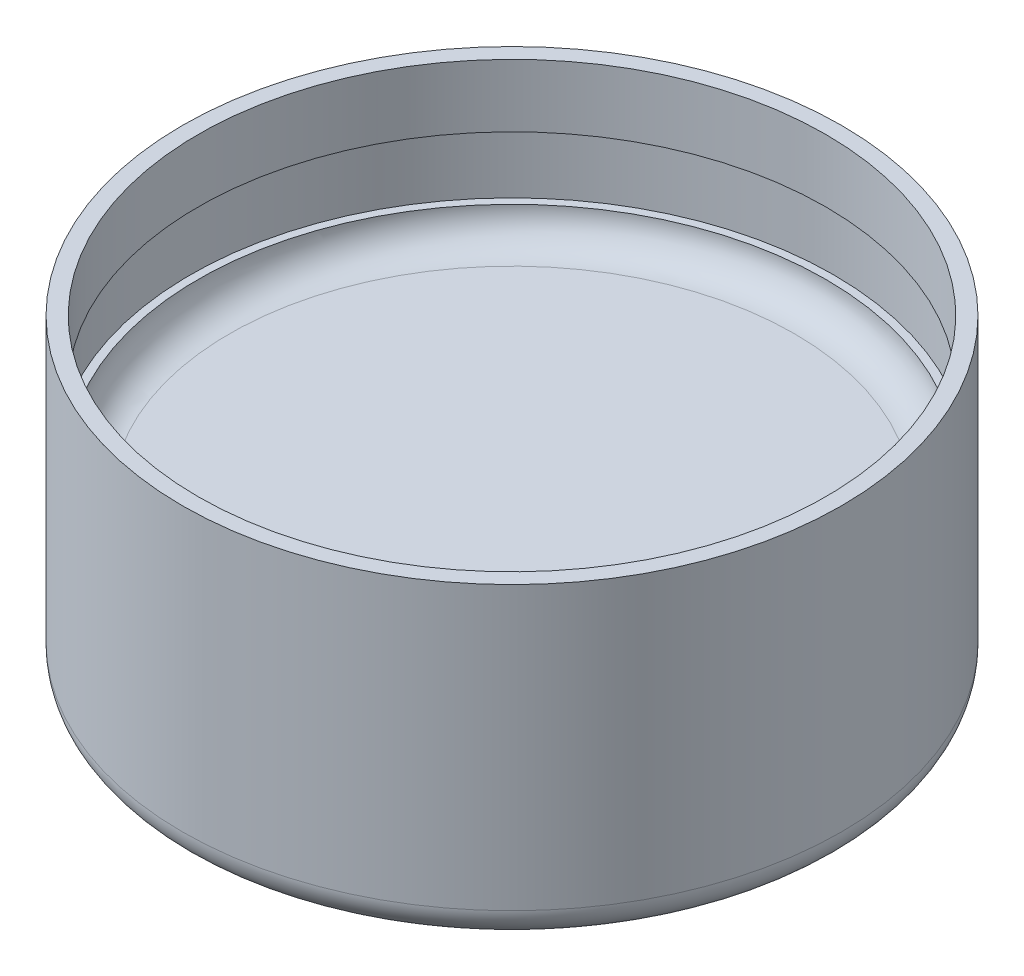
ISO-10303-21;
HEADER;
FILE_DESCRIPTION(('STEP AP214'),'2;1');
FILE_NAME('part.step','',(''),(''),'','','');
FILE_SCHEMA(('AUTOMOTIVE_DESIGN { 1 0 10303 214 1 1 1 1 }'));
ENDSEC;
DATA;
#1=APPLICATION_CONTEXT('core data for automotive mechanical design processes');
#2=APPLICATION_PROTOCOL_DEFINITION('international standard','automotive_design',2000,#1);
#3=PRODUCT_CONTEXT('',#1,'mechanical');
#4=PRODUCT('Part','Part','',(#3));
#5=PRODUCT_RELATED_PRODUCT_CATEGORY('part','',(#4));
#6=PRODUCT_DEFINITION_FORMATION('','',#4);
#7=PRODUCT_DEFINITION_CONTEXT('part definition',#1,'design');
#8=PRODUCT_DEFINITION('design','',#6,#7);
#9=PRODUCT_DEFINITION_SHAPE('','',#8);
#10=(LENGTH_UNIT() NAMED_UNIT(*) SI_UNIT(.MILLI.,.METRE.));
#11=(NAMED_UNIT(*) PLANE_ANGLE_UNIT() SI_UNIT($,.RADIAN.));
#12=(NAMED_UNIT(*) SI_UNIT($,.STERADIAN.) SOLID_ANGLE_UNIT());
#13=UNCERTAINTY_MEASURE_WITH_UNIT(LENGTH_MEASURE(1.E-05),#10,'distance_accuracy_value','');
#14=(GEOMETRIC_REPRESENTATION_CONTEXT(3) GLOBAL_UNCERTAINTY_ASSIGNED_CONTEXT((#13)) GLOBAL_UNIT_ASSIGNED_CONTEXT((#10,
#11,#12)) REPRESENTATION_CONTEXT('',''));
#15=CARTESIAN_POINT('',(0.,0.,0.));
#16=DIRECTION('',(0.,0.,1.));
#17=DIRECTION('',(1.,0.,0.));
#18=AXIS2_PLACEMENT_3D('',#15,#16,#17);
#19=CARTESIAN_POINT('',(0.,50.,0.));
#20=DIRECTION('',(0.,1.,0.));
#21=DIRECTION('',(0.,0.,1.));
#22=AXIS2_PLACEMENT_3D('',#19,#20,#21);
#23=CYLINDRICAL_SURFACE('',#22,100.);
#24=CARTESIAN_POINT('',(0.,100.,0.));
#25=DIRECTION('',(0.,1.,0.));
#26=DIRECTION('',(0.,0.,1.));
#27=AXIS2_PLACEMENT_3D('',#24,#25,#26);
#28=CIRCLE('',#27,100.);
#29=CARTESIAN_POINT('',(0.,100.,100.));
#30=VERTEX_POINT('',#29);
#31=EDGE_CURVE('E57',#30,#30,#28,.T.);
#32=ORIENTED_EDGE('',*,*,#31,.T.);
#33=EDGE_LOOP('',(#32));
#34=FACE_BOUND('',#33,.T.);
#35=CARTESIAN_POINT('',(0.,80.,0.));
#36=DIRECTION('',(0.,-1.,0.));
#37=DIRECTION('',(0.,0.,-1.));
#38=AXIS2_PLACEMENT_3D('',#35,#36,#37);
#39=CIRCLE('',#38,100.);
#40=CARTESIAN_POINT('',(0.,80.,-100.));
#41=VERTEX_POINT('',#40);
#42=EDGE_CURVE('E41',#41,#41,#39,.F.);
#43=ORIENTED_EDGE('',*,*,#42,.F.);
#44=EDGE_LOOP('',(#43));
#45=FACE_BOUND('',#44,.T.);
#46=ADVANCED_FACE('F37',(#34,#45),#23,.F.);
#47=CARTESIAN_POINT('',(0.,100.,0.));
#48=DIRECTION('',(0.,-1.,0.));
#49=DIRECTION('',(0.,0.,-1.));
#50=AXIS2_PLACEMENT_3D('',#47,#48,#49);
#51=CYLINDRICAL_SURFACE('',#50,105.);
#52=CARTESIAN_POINT('',(0.,9.99999999999999,0.));
#53=DIRECTION('',(0.,1.,0.));
#54=DIRECTION('',(0.,0.,1.));
#55=AXIS2_PLACEMENT_3D('',#52,#53,#54);
#56=CIRCLE('',#55,105.);
#57=CARTESIAN_POINT('',(0.,9.99999999999999,105.));
#58=VERTEX_POINT('',#57);
#59=EDGE_CURVE('E45',#58,#58,#56,.T.);
#60=ORIENTED_EDGE('',*,*,#59,.T.);
#61=EDGE_LOOP('',(#60));
#62=FACE_BOUND('',#61,.T.);
#63=CARTESIAN_POINT('',(0.,100.,0.));
#64=DIRECTION('',(0.,1.,0.));
#65=DIRECTION('',(0.,0.,1.));
#66=AXIS2_PLACEMENT_3D('',#63,#64,#65);
#67=CIRCLE('',#66,105.);
#68=CARTESIAN_POINT('',(0.,100.,105.));
#69=VERTEX_POINT('',#68);
#70=EDGE_CURVE('E54',#69,#69,#67,.T.);
#71=ORIENTED_EDGE('',*,*,#70,.F.);
#72=EDGE_LOOP('',(#71));
#73=FACE_BOUND('',#72,.T.);
#74=ADVANCED_FACE('F97',(#62,#73),#51,.T.);
#75=CARTESIAN_POINT('',(0.,100.,0.));
#76=DIRECTION('',(0.,1.,0.));
#77=DIRECTION('',(0.,0.,1.));
#78=AXIS2_PLACEMENT_3D('',#75,#76,#77);
#79=PLANE('',#78);
#80=ORIENTED_EDGE('',*,*,#31,.F.);
#81=EDGE_LOOP('',(#80));
#82=FACE_BOUND('',#81,.T.);
#83=ORIENTED_EDGE('',*,*,#70,.T.);
#84=EDGE_LOOP('',(#83));
#85=FACE_BOUND('',#84,.T.);
#86=ADVANCED_FACE('F102',(#82,#85),#79,.T.);
#87=CARTESIAN_POINT('',(0.,0.,0.));
#88=DIRECTION('',(0.,1.,0.));
#89=DIRECTION('',(0.,0.,1.));
#90=AXIS2_PLACEMENT_3D('',#87,#88,#89);
#91=PLANE('',#90);
#92=CARTESIAN_POINT('',(0.,0.,0.));
#93=DIRECTION('',(0.,1.,0.));
#94=DIRECTION('',(0.,0.,1.));
#95=AXIS2_PLACEMENT_3D('',#92,#93,#94);
#96=CIRCLE('',#95,95.);
#97=CARTESIAN_POINT('',(0.,0.,95.));
#98=VERTEX_POINT('',#97);
#99=EDGE_CURVE('E10',#98,#98,#96,.F.);
#100=ORIENTED_EDGE('',*,*,#99,.T.);
#101=EDGE_LOOP('',(#100));
#102=FACE_BOUND('',#101,.T.);
#103=ADVANCED_FACE('F109',(#102),#91,.F.);
#104=CARTESIAN_POINT('',(0.,9.99999999999999,0.));
#105=DIRECTION('',(0.,1.,0.));
#106=DIRECTION('',(0.,0.,1.));
#107=AXIS2_PLACEMENT_3D('',#104,#105,#106);
#108=TOROIDAL_SURFACE('',#107,95.,10.);
#109=ORIENTED_EDGE('',*,*,#99,.F.);
#110=EDGE_LOOP('',(#109));
#111=FACE_BOUND('',#110,.T.);
#112=ORIENTED_EDGE('',*,*,#59,.F.);
#113=EDGE_LOOP('',(#112));
#114=FACE_BOUND('',#113,.T.);
#115=ADVANCED_FACE('F39',(#111,#114),#108,.T.);
#116=CARTESIAN_POINT('',(0.,80.,0.));
#117=DIRECTION('',(0.,-1.,0.));
#118=DIRECTION('',(0.,0.,-1.));
#119=AXIS2_PLACEMENT_3D('',#116,#117,#118);
#120=PLANE('',#119);
#121=CARTESIAN_POINT('',(0.,80.,0.));
#122=DIRECTION('',(0.,-1.,0.));
#123=DIRECTION('',(0.,0.,-1.));
#124=AXIS2_PLACEMENT_3D('',#121,#122,#123);
#125=CIRCLE('',#124,102.5);
#126=CARTESIAN_POINT('',(0.,80.,-102.5));
#127=VERTEX_POINT('',#126);
#128=EDGE_CURVE('E66',#127,#127,#125,.T.);
#129=ORIENTED_EDGE('',*,*,#128,.T.);
#130=EDGE_LOOP('',(#129));
#131=FACE_BOUND('',#130,.T.);
#132=ORIENTED_EDGE('',*,*,#42,.T.);
#133=EDGE_LOOP('',(#132));
#134=FACE_BOUND('',#133,.T.);
#135=ADVANCED_FACE('F70',(#131,#134),#120,.T.);
#136=CARTESIAN_POINT('',(0.,60.,0.));
#137=DIRECTION('',(0.,-1.,0.));
#138=DIRECTION('',(0.,0.,-1.));
#139=AXIS2_PLACEMENT_3D('',#136,#137,#138);
#140=PLANE('',#139);
#141=CARTESIAN_POINT('',(0.,60.,0.));
#142=DIRECTION('',(0.,-1.,0.));
#143=DIRECTION('',(0.,0.,-1.));
#144=AXIS2_PLACEMENT_3D('',#141,#142,#143);
#145=CIRCLE('',#144,102.5);
#146=CARTESIAN_POINT('',(0.,60.,-102.5));
#147=VERTEX_POINT('',#146);
#148=EDGE_CURVE('E63',#147,#147,#145,.T.);
#149=ORIENTED_EDGE('',*,*,#148,.F.);
#150=EDGE_LOOP('',(#149));
#151=FACE_BOUND('',#150,.T.);
#152=CARTESIAN_POINT('',(0.,60.,0.));
#153=DIRECTION('',(0.,-1.,0.));
#154=DIRECTION('',(0.,0.,-1.));
#155=AXIS2_PLACEMENT_3D('',#152,#153,#154);
#156=CIRCLE('',#155,100.);
#157=CARTESIAN_POINT('',(0.,60.,-100.));
#158=VERTEX_POINT('',#157);
#159=EDGE_CURVE('E60',#158,#158,#156,.F.);
#160=ORIENTED_EDGE('',*,*,#159,.F.);
#161=EDGE_LOOP('',(#160));
#162=FACE_BOUND('',#161,.T.);
#163=ADVANCED_FACE('F77',(#151,#162),#140,.F.);
#164=CARTESIAN_POINT('',(0.,0.,0.));
#165=DIRECTION('',(0.,-1.,0.));
#166=DIRECTION('',(0.,0.,-1.));
#167=AXIS2_PLACEMENT_3D('',#164,#165,#166);
#168=CYLINDRICAL_SURFACE('',#167,102.5);
#169=ORIENTED_EDGE('',*,*,#128,.F.);
#170=EDGE_LOOP('',(#169));
#171=FACE_BOUND('',#170,.T.);
#172=ORIENTED_EDGE('',*,*,#148,.T.);
#173=EDGE_LOOP('',(#172));
#174=FACE_BOUND('',#173,.T.);
#175=ADVANCED_FACE('F73',(#171,#174),#168,.F.);
#176=CARTESIAN_POINT('',(0.,50.,0.));
#177=DIRECTION('',(0.,1.,0.));
#178=DIRECTION('',(0.,0.,1.));
#179=AXIS2_PLACEMENT_3D('',#176,#177,#178);
#180=PLANE('',#179);
#181=CARTESIAN_POINT('',(0.,50.,0.));
#182=DIRECTION('',(0.,1.,0.));
#183=DIRECTION('',(0.,0.,1.));
#184=AXIS2_PLACEMENT_3D('',#181,#182,#183);
#185=CIRCLE('',#184,90.);
#186=CARTESIAN_POINT('',(0.,50.,90.));
#187=VERTEX_POINT('',#186);
#188=EDGE_CURVE('E49',#187,#187,#185,.T.);
#189=ORIENTED_EDGE('',*,*,#188,.T.);
#190=EDGE_LOOP('',(#189));
#191=FACE_BOUND('',#190,.T.);
#192=ADVANCED_FACE('F76',(#191),#180,.T.);
#193=CARTESIAN_POINT('',(0.,60.,0.));
#194=DIRECTION('',(0.,1.,0.));
#195=DIRECTION('',(0.,0.,1.));
#196=AXIS2_PLACEMENT_3D('',#193,#194,#195);
#197=TOROIDAL_SURFACE('',#196,90.,10.);
#198=ORIENTED_EDGE('',*,*,#159,.T.);
#199=EDGE_LOOP('',(#198));
#200=FACE_BOUND('',#199,.T.);
#201=ORIENTED_EDGE('',*,*,#188,.F.);
#202=EDGE_LOOP('',(#201));
#203=FACE_BOUND('',#202,.T.);
#204=ADVANCED_FACE('F86',(#200,#203),#197,.F.);
#205=CLOSED_SHELL('',(#46,#74,#86,#103,#115,#135,#163,#175,#192,#204));
#206=MANIFOLD_SOLID_BREP('B2',#205);
#207=ADVANCED_BREP_SHAPE_REPRESENTATION('',(#18,#206),#14);
#208=SHAPE_DEFINITION_REPRESENTATION(#9,#207);
ENDSEC;
END-ISO-10303-21;
